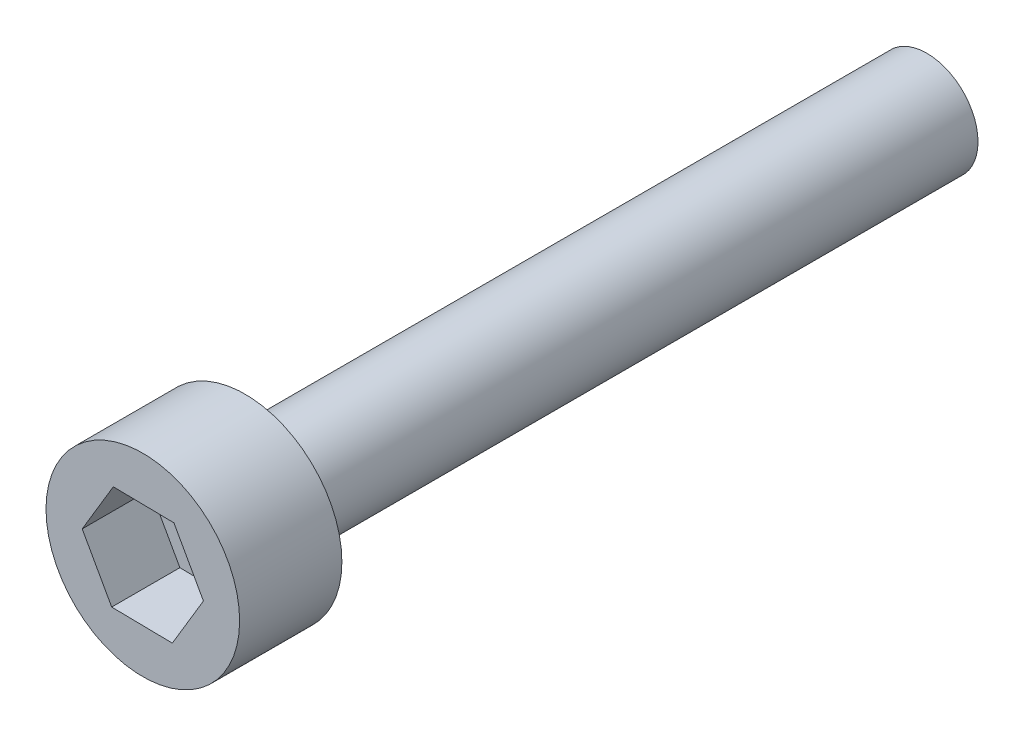
ISO-10303-21;
HEADER;
FILE_DESCRIPTION(('STEP AP214'),'2;1');
FILE_NAME('part.step','',(''),(''),'','','');
FILE_SCHEMA(('AUTOMOTIVE_DESIGN { 1 0 10303 214 1 1 1 1 }'));
ENDSEC;
DATA;
#1=APPLICATION_CONTEXT('core data for automotive mechanical design processes');
#2=APPLICATION_PROTOCOL_DEFINITION('international standard','automotive_design',2000,#1);
#3=PRODUCT_CONTEXT('',#1,'mechanical');
#4=PRODUCT('Part','Part','',(#3));
#5=PRODUCT_RELATED_PRODUCT_CATEGORY('part','',(#4));
#6=PRODUCT_DEFINITION_FORMATION('','',#4);
#7=PRODUCT_DEFINITION_CONTEXT('part definition',#1,'design');
#8=PRODUCT_DEFINITION('design','',#6,#7);
#9=PRODUCT_DEFINITION_SHAPE('','',#8);
#10=(LENGTH_UNIT() NAMED_UNIT(*) SI_UNIT(.MILLI.,.METRE.));
#11=(NAMED_UNIT(*) PLANE_ANGLE_UNIT() SI_UNIT($,.RADIAN.));
#12=(NAMED_UNIT(*) SI_UNIT($,.STERADIAN.) SOLID_ANGLE_UNIT());
#13=UNCERTAINTY_MEASURE_WITH_UNIT(LENGTH_MEASURE(1.E-05),#10,'distance_accuracy_value','');
#14=(GEOMETRIC_REPRESENTATION_CONTEXT(3) GLOBAL_UNCERTAINTY_ASSIGNED_CONTEXT((#13)) GLOBAL_UNIT_ASSIGNED_CONTEXT((#10,
#11,#12)) REPRESENTATION_CONTEXT('',''));
#15=CARTESIAN_POINT('',(0.,0.,0.));
#16=DIRECTION('',(0.,0.,1.));
#17=DIRECTION('',(1.,0.,0.));
#18=AXIS2_PLACEMENT_3D('',#15,#16,#17);
#19=CARTESIAN_POINT('',(0.,0.,3.));
#20=DIRECTION('',(0.,0.,-1.));
#21=DIRECTION('',(-1.,0.,0.));
#22=AXIS2_PLACEMENT_3D('',#19,#20,#21);
#23=CYLINDRICAL_SURFACE('',#22,2.84);
#24=CARTESIAN_POINT('',(0.,0.,3.));
#25=DIRECTION('',(0.,0.,1.));
#26=DIRECTION('',(1.,0.,0.));
#27=AXIS2_PLACEMENT_3D('',#24,#25,#26);
#28=CIRCLE('',#27,2.84);
#29=CARTESIAN_POINT('',(2.84,0.,3.));
#30=VERTEX_POINT('',#29);
#31=EDGE_CURVE('E42',#30,#30,#28,.T.);
#32=ORIENTED_EDGE('',*,*,#31,.F.);
#33=EDGE_LOOP('',(#32));
#34=FACE_BOUND('',#33,.T.);
#35=CARTESIAN_POINT('',(0.,0.,0.));
#36=DIRECTION('',(0.,0.,1.));
#37=DIRECTION('',(1.,0.,0.));
#38=AXIS2_PLACEMENT_3D('',#35,#36,#37);
#39=CIRCLE('',#38,2.84);
#40=CARTESIAN_POINT('',(2.84,0.,0.));
#41=VERTEX_POINT('',#40);
#42=EDGE_CURVE('E144',#41,#41,#39,.T.);
#43=ORIENTED_EDGE('',*,*,#42,.T.);
#44=EDGE_LOOP('',(#43));
#45=FACE_BOUND('',#44,.T.);
#46=ADVANCED_FACE('F35',(#34,#45),#23,.T.);
#47=CARTESIAN_POINT('',(0.,0.,3.));
#48=DIRECTION('',(0.,0.,1.));
#49=DIRECTION('',(1.,0.,0.));
#50=AXIS2_PLACEMENT_3D('',#47,#48,#49);
#51=PLANE('',#50);
#52=DIRECTION('',(-0.486688945822522,0.873575337343129,0.));
#53=VECTOR('',#52,1.);
#54=CARTESIAN_POINT('',(1.77803061008708,-0.027211815938925,3.));
#55=LINE('',#54,#53);
#56=CARTESIAN_POINT('',(1.77803061008708,-0.027211815938925,3.));
#57=VERTEX_POINT('',#56);
#58=CARTESIAN_POINT('',(0.912581428929756,1.52621376907229,3.));
#59=VERTEX_POINT('',#58);
#60=EDGE_CURVE('E49',#57,#59,#55,.T.);
#61=ORIENTED_EDGE('',*,*,#60,.F.);
#62=DIRECTION('',(0.513193961347449,0.858272659494937,0.));
#63=VECTOR('',#62,1.);
#64=CARTESIAN_POINT('',(0.865449181157325,-1.55342558501122,3.));
#65=LINE('',#64,#63);
#66=CARTESIAN_POINT('',(0.865449181157325,-1.55342558501122,3.));
#67=VERTEX_POINT('',#66);
#68=EDGE_CURVE('E132',#67,#57,#65,.T.);
#69=ORIENTED_EDGE('',*,*,#68,.F.);
#70=DIRECTION('',(0.999882907169972,-0.0153026778481919,0.));
#71=VECTOR('',#70,1.);
#72=CARTESIAN_POINT('',(-0.912581428929756,-1.52621376907229,3.));
#73=LINE('',#72,#71);
#74=CARTESIAN_POINT('',(-0.912581428929756,-1.52621376907229,3.));
#75=VERTEX_POINT('',#74);
#76=EDGE_CURVE('E130',#75,#67,#73,.T.);
#77=ORIENTED_EDGE('',*,*,#76,.F.);
#78=DIRECTION('',(0.486688945822522,-0.873575337343129,0.));
#79=VECTOR('',#78,1.);
#80=CARTESIAN_POINT('',(-1.77803061008708,0.0272118159389248,3.));
#81=LINE('',#80,#79);
#82=CARTESIAN_POINT('',(-1.77803061008708,0.0272118159389248,3.));
#83=VERTEX_POINT('',#82);
#84=EDGE_CURVE('E97',#83,#75,#81,.T.);
#85=ORIENTED_EDGE('',*,*,#84,.F.);
#86=DIRECTION('',(-0.513193961347449,-0.858272659494938,0.));
#87=VECTOR('',#86,1.);
#88=CARTESIAN_POINT('',(-0.865449181157325,1.55342558501122,3.));
#89=LINE('',#88,#87);
#90=CARTESIAN_POINT('',(-0.865449181157325,1.55342558501122,3.));
#91=VERTEX_POINT('',#90);
#92=EDGE_CURVE('E126',#91,#83,#89,.T.);
#93=ORIENTED_EDGE('',*,*,#92,.F.);
#94=DIRECTION('',(-0.999882907169972,0.0153026778481919,0.));
#95=VECTOR('',#94,1.);
#96=CARTESIAN_POINT('',(0.912581428929756,1.52621376907229,3.));
#97=LINE('',#96,#95);
#98=EDGE_CURVE('E123',#59,#91,#97,.T.);
#99=ORIENTED_EDGE('',*,*,#98,.F.);
#100=EDGE_LOOP('',(#61,#69,#77,#85,#93,#99));
#101=FACE_BOUND('',#100,.T.);
#102=ORIENTED_EDGE('',*,*,#31,.T.);
#103=EDGE_LOOP('',(#102));
#104=FACE_BOUND('',#103,.T.);
#105=ADVANCED_FACE('F153',(#101,#104),#51,.T.);
#106=CARTESIAN_POINT('',(0.,0.,0.));
#107=DIRECTION('',(0.,0.,1.));
#108=DIRECTION('',(1.,0.,0.));
#109=AXIS2_PLACEMENT_3D('',#106,#107,#108);
#110=PLANE('',#109);
#111=CARTESIAN_POINT('',(0.,0.,0.));
#112=DIRECTION('',(0.,0.,1.));
#113=DIRECTION('',(1.,0.,0.));
#114=AXIS2_PLACEMENT_3D('',#111,#112,#113);
#115=CIRCLE('',#114,1.5);
#116=CARTESIAN_POINT('',(1.5,0.,0.));
#117=VERTEX_POINT('',#116);
#118=EDGE_CURVE('E11',#117,#117,#115,.F.);
#119=ORIENTED_EDGE('',*,*,#118,.F.);
#120=EDGE_LOOP('',(#119));
#121=FACE_BOUND('',#120,.T.);
#122=ORIENTED_EDGE('',*,*,#42,.F.);
#123=EDGE_LOOP('',(#122));
#124=FACE_BOUND('',#123,.T.);
#125=ADVANCED_FACE('F150',(#121,#124),#110,.F.);
#126=CARTESIAN_POINT('',(0.,0.,-20.));
#127=DIRECTION('',(0.,0.,1.));
#128=DIRECTION('',(1.,0.,0.));
#129=AXIS2_PLACEMENT_3D('',#126,#127,#128);
#130=CYLINDRICAL_SURFACE('',#129,1.5);
#131=CARTESIAN_POINT('',(0.,0.,-20.));
#132=DIRECTION('',(0.,0.,-1.));
#133=DIRECTION('',(-1.,0.,0.));
#134=AXIS2_PLACEMENT_3D('',#131,#132,#133);
#135=CIRCLE('',#134,1.5);
#136=CARTESIAN_POINT('',(-1.5,0.,-20.));
#137=VERTEX_POINT('',#136);
#138=EDGE_CURVE('E136',#137,#137,#135,.T.);
#139=ORIENTED_EDGE('',*,*,#138,.F.);
#140=EDGE_LOOP('',(#139));
#141=FACE_BOUND('',#140,.T.);
#142=ORIENTED_EDGE('',*,*,#118,.T.);
#143=EDGE_LOOP('',(#142));
#144=FACE_BOUND('',#143,.T.);
#145=ADVANCED_FACE('F152',(#141,#144),#130,.T.);
#146=CARTESIAN_POINT('',(0.,0.,-20.));
#147=DIRECTION('',(0.,0.,-1.));
#148=DIRECTION('',(-1.,0.,0.));
#149=AXIS2_PLACEMENT_3D('',#146,#147,#148);
#150=PLANE('',#149);
#151=ORIENTED_EDGE('',*,*,#138,.T.);
#152=EDGE_LOOP('',(#151));
#153=FACE_BOUND('',#152,.T.);
#154=ADVANCED_FACE('F159',(#153),#150,.T.);
#155=CARTESIAN_POINT('',(1.77803061008708,-0.027211815938925,1.));
#156=DIRECTION('',(0.873575337343129,0.486688945822522,0.));
#157=DIRECTION('',(-0.486688945822522,0.873575337343129,0.));
#158=AXIS2_PLACEMENT_3D('',#155,#156,#157);
#159=PLANE('',#158);
#160=ORIENTED_EDGE('',*,*,#60,.T.);
#161=DIRECTION('',(0.,0.,1.));
#162=VECTOR('',#161,1.);
#163=CARTESIAN_POINT('',(0.912581428929756,1.52621376907229,1.));
#164=LINE('',#163,#162);
#165=CARTESIAN_POINT('',(0.912581428929756,1.52621376907229,1.));
#166=VERTEX_POINT('',#165);
#167=EDGE_CURVE('E79',#166,#59,#164,.T.);
#168=ORIENTED_EDGE('',*,*,#167,.F.);
#169=DIRECTION('',(-0.486688945822522,0.873575337343129,0.));
#170=VECTOR('',#169,1.);
#171=CARTESIAN_POINT('',(1.77803061008708,-0.027211815938925,1.));
#172=LINE('',#171,#170);
#173=CARTESIAN_POINT('',(1.77803061008708,-0.027211815938925,1.));
#174=VERTEX_POINT('',#173);
#175=EDGE_CURVE('E134',#174,#166,#172,.T.);
#176=ORIENTED_EDGE('',*,*,#175,.F.);
#177=DIRECTION('',(0.,0.,1.));
#178=VECTOR('',#177,1.);
#179=CARTESIAN_POINT('',(1.77803061008708,-0.027211815938925,1.));
#180=LINE('',#179,#178);
#181=EDGE_CURVE('E57',#174,#57,#180,.T.);
#182=ORIENTED_EDGE('',*,*,#181,.T.);
#183=EDGE_LOOP('',(#160,#168,#176,#182));
#184=FACE_BOUND('',#183,.T.);
#185=ADVANCED_FACE('F186',(#184),#159,.F.);
#186=CARTESIAN_POINT('',(0.865449181157325,-1.55342558501122,1.));
#187=DIRECTION('',(0.858272659494937,-0.513193961347449,0.));
#188=DIRECTION('',(0.513193961347449,0.858272659494937,0.));
#189=AXIS2_PLACEMENT_3D('',#186,#187,#188);
#190=PLANE('',#189);
#191=ORIENTED_EDGE('',*,*,#68,.T.);
#192=ORIENTED_EDGE('',*,*,#181,.F.);
#193=DIRECTION('',(0.513193961347449,0.858272659494937,0.));
#194=VECTOR('',#193,1.);
#195=CARTESIAN_POINT('',(0.865449181157325,-1.55342558501122,1.));
#196=LINE('',#195,#194);
#197=CARTESIAN_POINT('',(0.865449181157325,-1.55342558501122,1.));
#198=VERTEX_POINT('',#197);
#199=EDGE_CURVE('E109',#198,#174,#196,.T.);
#200=ORIENTED_EDGE('',*,*,#199,.F.);
#201=DIRECTION('',(0.,0.,1.));
#202=VECTOR('',#201,1.);
#203=CARTESIAN_POINT('',(0.865449181157325,-1.55342558501122,1.));
#204=LINE('',#203,#202);
#205=EDGE_CURVE('E101',#198,#67,#204,.T.);
#206=ORIENTED_EDGE('',*,*,#205,.T.);
#207=EDGE_LOOP('',(#191,#192,#200,#206));
#208=FACE_BOUND('',#207,.T.);
#209=ADVANCED_FACE('F191',(#208),#190,.F.);
#210=CARTESIAN_POINT('',(-0.912581428929756,-1.52621376907229,1.));
#211=DIRECTION('',(-0.0153026778481919,-0.999882907169972,0.));
#212=DIRECTION('',(0.999882907169972,-0.0153026778481919,0.));
#213=AXIS2_PLACEMENT_3D('',#210,#211,#212);
#214=PLANE('',#213);
#215=ORIENTED_EDGE('',*,*,#76,.T.);
#216=ORIENTED_EDGE('',*,*,#205,.F.);
#217=DIRECTION('',(0.999882907169972,-0.0153026778481919,0.));
#218=VECTOR('',#217,1.);
#219=CARTESIAN_POINT('',(-0.912581428929756,-1.52621376907229,1.));
#220=LINE('',#219,#218);
#221=CARTESIAN_POINT('',(-0.912581428929756,-1.52621376907229,1.));
#222=VERTEX_POINT('',#221);
#223=EDGE_CURVE('E105',#222,#198,#220,.T.);
#224=ORIENTED_EDGE('',*,*,#223,.F.);
#225=DIRECTION('',(0.,0.,1.));
#226=VECTOR('',#225,1.);
#227=CARTESIAN_POINT('',(-0.912581428929756,-1.52621376907229,1.));
#228=LINE('',#227,#226);
#229=EDGE_CURVE('E90',#222,#75,#228,.T.);
#230=ORIENTED_EDGE('',*,*,#229,.T.);
#231=EDGE_LOOP('',(#215,#216,#224,#230));
#232=FACE_BOUND('',#231,.T.);
#233=ADVANCED_FACE('F106',(#232),#214,.F.);
#234=CARTESIAN_POINT('',(-1.77803061008708,0.0272118159389248,1.));
#235=DIRECTION('',(-0.873575337343129,-0.486688945822522,0.));
#236=DIRECTION('',(0.486688945822522,-0.873575337343129,0.));
#237=AXIS2_PLACEMENT_3D('',#234,#235,#236);
#238=PLANE('',#237);
#239=ORIENTED_EDGE('',*,*,#84,.T.);
#240=ORIENTED_EDGE('',*,*,#229,.F.);
#241=DIRECTION('',(0.486688945822522,-0.873575337343129,0.));
#242=VECTOR('',#241,1.);
#243=CARTESIAN_POINT('',(-1.77803061008708,0.0272118159389248,1.));
#244=LINE('',#243,#242);
#245=CARTESIAN_POINT('',(-1.77803061008708,0.0272118159389248,1.));
#246=VERTEX_POINT('',#245);
#247=EDGE_CURVE('E94',#246,#222,#244,.T.);
#248=ORIENTED_EDGE('',*,*,#247,.F.);
#249=DIRECTION('',(0.,0.,1.));
#250=VECTOR('',#249,1.);
#251=CARTESIAN_POINT('',(-1.77803061008708,0.0272118159389248,1.));
#252=LINE('',#251,#250);
#253=EDGE_CURVE('E102',#246,#83,#252,.T.);
#254=ORIENTED_EDGE('',*,*,#253,.T.);
#255=EDGE_LOOP('',(#239,#240,#248,#254));
#256=FACE_BOUND('',#255,.T.);
#257=ADVANCED_FACE('F92',(#256),#238,.F.);
#258=CARTESIAN_POINT('',(-0.865449181157325,1.55342558501122,1.));
#259=DIRECTION('',(-0.858272659494937,0.513193961347449,0.));
#260=DIRECTION('',(-0.513193961347449,-0.858272659494938,0.));
#261=AXIS2_PLACEMENT_3D('',#258,#259,#260);
#262=PLANE('',#261);
#263=ORIENTED_EDGE('',*,*,#92,.T.);
#264=ORIENTED_EDGE('',*,*,#253,.F.);
#265=DIRECTION('',(-0.513193961347449,-0.858272659494938,0.));
#266=VECTOR('',#265,1.);
#267=CARTESIAN_POINT('',(-0.865449181157325,1.55342558501122,1.));
#268=LINE('',#267,#266);
#269=CARTESIAN_POINT('',(-0.865449181157325,1.55342558501122,1.));
#270=VERTEX_POINT('',#269);
#271=EDGE_CURVE('E115',#270,#246,#268,.T.);
#272=ORIENTED_EDGE('',*,*,#271,.F.);
#273=DIRECTION('',(0.,0.,1.));
#274=VECTOR('',#273,1.);
#275=CARTESIAN_POINT('',(-0.865449181157325,1.55342558501122,1.));
#276=LINE('',#275,#274);
#277=EDGE_CURVE('E139',#270,#91,#276,.T.);
#278=ORIENTED_EDGE('',*,*,#277,.T.);
#279=EDGE_LOOP('',(#263,#264,#272,#278));
#280=FACE_BOUND('',#279,.T.);
#281=ADVANCED_FACE('F216',(#280),#262,.F.);
#282=CARTESIAN_POINT('',(0.912581428929756,1.52621376907229,1.));
#283=DIRECTION('',(0.0153026778481919,0.999882907169972,0.));
#284=DIRECTION('',(-0.999882907169972,0.0153026778481919,0.));
#285=AXIS2_PLACEMENT_3D('',#282,#283,#284);
#286=PLANE('',#285);
#287=ORIENTED_EDGE('',*,*,#98,.T.);
#288=ORIENTED_EDGE('',*,*,#277,.F.);
#289=DIRECTION('',(-0.999882907169972,0.0153026778481919,0.));
#290=VECTOR('',#289,1.);
#291=CARTESIAN_POINT('',(0.912581428929756,1.52621376907229,1.));
#292=LINE('',#291,#290);
#293=EDGE_CURVE('E117',#166,#270,#292,.T.);
#294=ORIENTED_EDGE('',*,*,#293,.F.);
#295=ORIENTED_EDGE('',*,*,#167,.T.);
#296=EDGE_LOOP('',(#287,#288,#294,#295));
#297=FACE_BOUND('',#296,.T.);
#298=ADVANCED_FACE('F225',(#297),#286,.F.);
#299=CARTESIAN_POINT('',(0.,0.,1.));
#300=DIRECTION('',(0.,0.,1.));
#301=DIRECTION('',(1.,0.,0.));
#302=AXIS2_PLACEMENT_3D('',#299,#300,#301);
#303=PLANE('',#302);
#304=ORIENTED_EDGE('',*,*,#175,.T.);
#305=ORIENTED_EDGE('',*,*,#293,.T.);
#306=ORIENTED_EDGE('',*,*,#271,.T.);
#307=ORIENTED_EDGE('',*,*,#247,.T.);
#308=ORIENTED_EDGE('',*,*,#223,.T.);
#309=ORIENTED_EDGE('',*,*,#199,.T.);
#310=EDGE_LOOP('',(#304,#305,#306,#307,#308,#309));
#311=FACE_BOUND('',#310,.T.);
#312=ADVANCED_FACE('F112',(#311),#303,.T.);
#313=CLOSED_SHELL('',(#46,#105,#125,#145,#154,#185,#209,#233,#257,#281,#298,#312));
#314=MANIFOLD_SOLID_BREP('B2',#313);
#315=ADVANCED_BREP_SHAPE_REPRESENTATION('',(#18,#314),#14);
#316=SHAPE_DEFINITION_REPRESENTATION(#9,#315);
ENDSEC;
END-ISO-10303-21;
